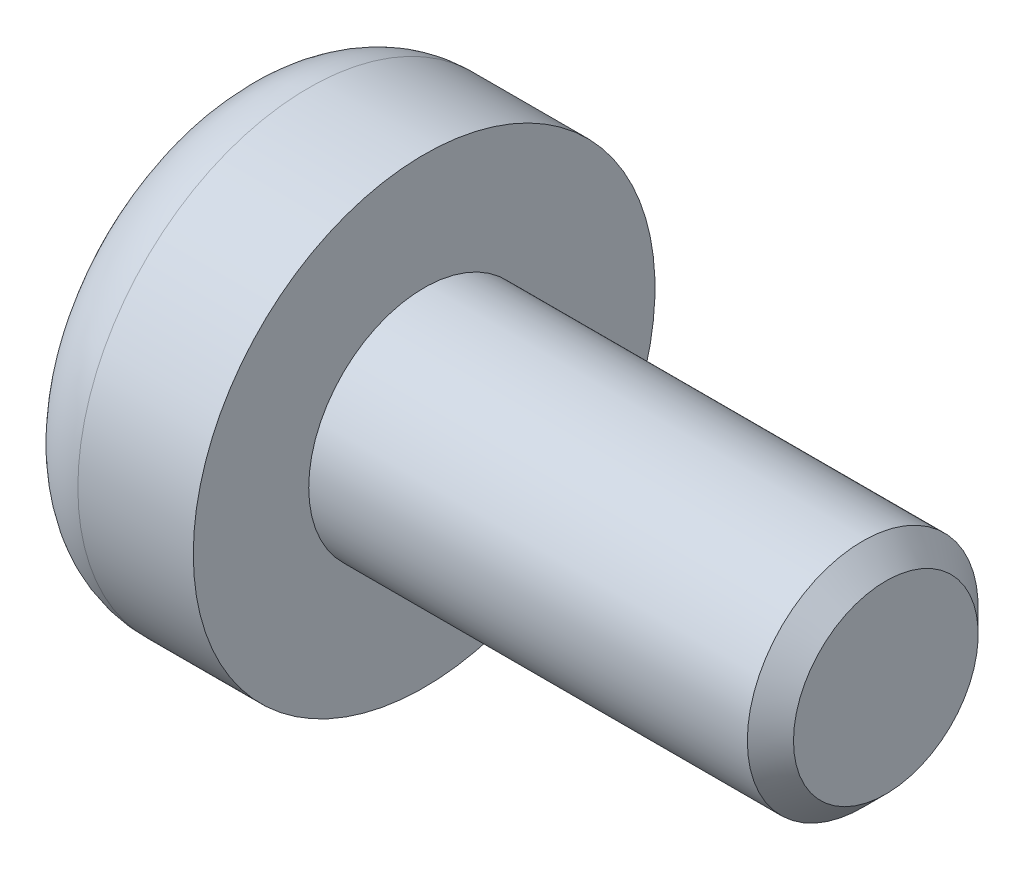
ISO-10303-21;
HEADER;
FILE_DESCRIPTION(('STEP AP214'),'2;1');
FILE_NAME('part.step','',(''),(''),'','','');
FILE_SCHEMA(('AUTOMOTIVE_DESIGN { 1 0 10303 214 1 1 1 1 }'));
ENDSEC;
DATA;
#1=APPLICATION_CONTEXT('core data for automotive mechanical design processes');
#2=APPLICATION_PROTOCOL_DEFINITION('international standard','automotive_design',2000,#1);
#3=PRODUCT_CONTEXT('',#1,'mechanical');
#4=PRODUCT('Part','Part','',(#3));
#5=PRODUCT_RELATED_PRODUCT_CATEGORY('part','',(#4));
#6=PRODUCT_DEFINITION_FORMATION('','',#4);
#7=PRODUCT_DEFINITION_CONTEXT('part definition',#1,'design');
#8=PRODUCT_DEFINITION('design','',#6,#7);
#9=PRODUCT_DEFINITION_SHAPE('','',#8);
#10=(LENGTH_UNIT() NAMED_UNIT(*) SI_UNIT(.MILLI.,.METRE.));
#11=(NAMED_UNIT(*) PLANE_ANGLE_UNIT() SI_UNIT($,.RADIAN.));
#12=(NAMED_UNIT(*) SI_UNIT($,.STERADIAN.) SOLID_ANGLE_UNIT());
#13=UNCERTAINTY_MEASURE_WITH_UNIT(LENGTH_MEASURE(1.E-05),#10,'distance_accuracy_value','');
#14=(GEOMETRIC_REPRESENTATION_CONTEXT(3) GLOBAL_UNCERTAINTY_ASSIGNED_CONTEXT((#13)) GLOBAL_UNIT_ASSIGNED_CONTEXT((#10,
#11,#12)) REPRESENTATION_CONTEXT('',''));
#15=CARTESIAN_POINT('',(0.,0.,0.));
#16=DIRECTION('',(0.,0.,1.));
#17=DIRECTION('',(1.,0.,0.));
#18=AXIS2_PLACEMENT_3D('',#15,#16,#17);
#19=CARTESIAN_POINT('',(1.,-1.,0.577350269189625));
#20=DIRECTION('',(1.,0.,0.));
#21=DIRECTION('',(0.,0.,-1.));
#22=AXIS2_PLACEMENT_3D('',#19,#20,#21);
#23=PLANE('',#22);
#24=DIRECTION('',(0.,-0.86602540378444,0.499999999999998));
#25=VECTOR('',#24,1.);
#26=CARTESIAN_POINT('',(1.,1.,0.577350269189625));
#27=LINE('',#26,#25);
#28=CARTESIAN_POINT('',(1.,0.,1.15470053837925));
#29=VERTEX_POINT('',#28);
#30=CARTESIAN_POINT('',(1.,1.,0.577350269189625));
#31=VERTEX_POINT('',#30);
#32=EDGE_CURVE('E73',#29,#31,#27,.F.);
#33=ORIENTED_EDGE('',*,*,#32,.T.);
#34=DIRECTION('',(0.,0.,1.));
#35=VECTOR('',#34,1.);
#36=CARTESIAN_POINT('',(1.,1.,-0.577350269189625));
#37=LINE('',#36,#35);
#38=CARTESIAN_POINT('',(1.,1.,-0.577350269189625));
#39=VERTEX_POINT('',#38);
#40=EDGE_CURVE('E70',#31,#39,#37,.F.);
#41=ORIENTED_EDGE('',*,*,#40,.T.);
#42=DIRECTION('',(0.,0.86602540378444,0.499999999999998));
#43=VECTOR('',#42,1.);
#44=CARTESIAN_POINT('',(1.,0.,-1.15470053837925));
#45=LINE('',#44,#43);
#46=CARTESIAN_POINT('',(1.,0.,-1.15470053837925));
#47=VERTEX_POINT('',#46);
#48=EDGE_CURVE('E67',#39,#47,#45,.F.);
#49=ORIENTED_EDGE('',*,*,#48,.T.);
#50=DIRECTION('',(0.,0.86602540378444,-0.499999999999998));
#51=VECTOR('',#50,1.);
#52=CARTESIAN_POINT('',(1.,-1.,-0.577350269189625));
#53=LINE('',#52,#51);
#54=CARTESIAN_POINT('',(1.,-1.,-0.577350269189625));
#55=VERTEX_POINT('',#54);
#56=EDGE_CURVE('E90',#47,#55,#53,.F.);
#57=ORIENTED_EDGE('',*,*,#56,.T.);
#58=DIRECTION('',(0.,0.,-1.));
#59=VECTOR('',#58,1.);
#60=CARTESIAN_POINT('',(1.,-1.,0.577350269189625));
#61=LINE('',#60,#59);
#62=CARTESIAN_POINT('',(1.,-1.,0.577350269189625));
#63=VERTEX_POINT('',#62);
#64=EDGE_CURVE('E152',#55,#63,#61,.F.);
#65=ORIENTED_EDGE('',*,*,#64,.T.);
#66=DIRECTION('',(0.,-0.86602540378444,-0.499999999999998));
#67=VECTOR('',#66,1.);
#68=CARTESIAN_POINT('',(1.,0.,1.15470053837925));
#69=LINE('',#68,#67);
#70=EDGE_CURVE('E147',#63,#29,#69,.F.);
#71=ORIENTED_EDGE('',*,*,#70,.T.);
#72=EDGE_LOOP('',(#33,#41,#49,#57,#65,#71));
#73=FACE_BOUND('',#72,.T.);
#74=ADVANCED_FACE('F16',(#73),#23,.F.);
#75=CARTESIAN_POINT('',(1.,1.,-0.577350269189625));
#76=DIRECTION('',(0.,1.,0.));
#77=DIRECTION('',(0.,0.,1.));
#78=AXIS2_PLACEMENT_3D('',#75,#76,#77);
#79=PLANE('',#78);
#80=DIRECTION('',(1.,0.,0.));
#81=VECTOR('',#80,1.);
#82=CARTESIAN_POINT('',(1.,1.,-0.577350269189625));
#83=LINE('',#82,#81);
#84=CARTESIAN_POINT('',(0.,1.,-0.577350269189625));
#85=VERTEX_POINT('',#84);
#86=EDGE_CURVE('E76',#85,#39,#83,.T.);
#87=ORIENTED_EDGE('',*,*,#86,.T.);
#88=ORIENTED_EDGE('',*,*,#40,.F.);
#89=DIRECTION('',(1.,0.,0.));
#90=VECTOR('',#89,1.);
#91=CARTESIAN_POINT('',(1.,1.,0.577350269189625));
#92=LINE('',#91,#90);
#93=CARTESIAN_POINT('',(0.,1.,0.577350269189625));
#94=VERTEX_POINT('',#93);
#95=EDGE_CURVE('E137',#31,#94,#92,.F.);
#96=ORIENTED_EDGE('',*,*,#95,.T.);
#97=DIRECTION('',(0.,0.,-1.));
#98=VECTOR('',#97,1.);
#99=CARTESIAN_POINT('',(0.,1.,0.));
#100=LINE('',#99,#98);
#101=EDGE_CURVE('E81',#94,#85,#100,.T.);
#102=ORIENTED_EDGE('',*,*,#101,.T.);
#103=EDGE_LOOP('',(#87,#88,#96,#102));
#104=FACE_BOUND('',#103,.T.);
#105=ADVANCED_FACE('F79',(#104),#79,.F.);
#106=CARTESIAN_POINT('',(1.,0.,-1.15470053837925));
#107=DIRECTION('',(0.,0.499999999999998,-0.86602540378444));
#108=DIRECTION('',(0.,0.86602540378444,0.499999999999998));
#109=AXIS2_PLACEMENT_3D('',#106,#107,#108);
#110=PLANE('',#109);
#111=DIRECTION('',(1.,0.,0.));
#112=VECTOR('',#111,1.);
#113=CARTESIAN_POINT('',(1.,0.,-1.15470053837925));
#114=LINE('',#113,#112);
#115=CARTESIAN_POINT('',(0.,0.,-1.15470053837925));
#116=VERTEX_POINT('',#115);
#117=EDGE_CURVE('E87',#116,#47,#114,.T.);
#118=ORIENTED_EDGE('',*,*,#117,.T.);
#119=ORIENTED_EDGE('',*,*,#48,.F.);
#120=ORIENTED_EDGE('',*,*,#86,.F.);
#121=DIRECTION('',(0.,-0.86602540378444,-0.499999999999998));
#122=VECTOR('',#121,1.);
#123=CARTESIAN_POINT('',(0.,1.,-0.577350269189625));
#124=LINE('',#123,#122);
#125=EDGE_CURVE('E175',#85,#116,#124,.T.);
#126=ORIENTED_EDGE('',*,*,#125,.T.);
#127=EDGE_LOOP('',(#118,#119,#120,#126));
#128=FACE_BOUND('',#127,.T.);
#129=ADVANCED_FACE('F85',(#128),#110,.F.);
#130=CARTESIAN_POINT('',(1.,-1.,-0.577350269189625));
#131=DIRECTION('',(0.,-0.499999999999998,-0.86602540378444));
#132=DIRECTION('',(0.,0.86602540378444,-0.499999999999998));
#133=AXIS2_PLACEMENT_3D('',#130,#131,#132);
#134=PLANE('',#133);
#135=DIRECTION('',(1.,0.,0.));
#136=VECTOR('',#135,1.);
#137=CARTESIAN_POINT('',(1.,-1.,-0.577350269189625));
#138=LINE('',#137,#136);
#139=CARTESIAN_POINT('',(0.,-1.,-0.577350269189625));
#140=VERTEX_POINT('',#139);
#141=EDGE_CURVE('E154',#140,#55,#138,.T.);
#142=ORIENTED_EDGE('',*,*,#141,.T.);
#143=ORIENTED_EDGE('',*,*,#56,.F.);
#144=ORIENTED_EDGE('',*,*,#117,.F.);
#145=DIRECTION('',(0.,-0.86602540378444,0.499999999999998));
#146=VECTOR('',#145,1.);
#147=CARTESIAN_POINT('',(0.,0.,-1.15470053837925));
#148=LINE('',#147,#146);
#149=EDGE_CURVE('E161',#116,#140,#148,.T.);
#150=ORIENTED_EDGE('',*,*,#149,.T.);
#151=EDGE_LOOP('',(#142,#143,#144,#150));
#152=FACE_BOUND('',#151,.T.);
#153=ADVANCED_FACE('F159',(#152),#134,.F.);
#154=CARTESIAN_POINT('',(1.,-1.,0.577350269189625));
#155=DIRECTION('',(0.,-1.,0.));
#156=DIRECTION('',(0.,0.,-1.));
#157=AXIS2_PLACEMENT_3D('',#154,#155,#156);
#158=PLANE('',#157);
#159=DIRECTION('',(1.,0.,0.));
#160=VECTOR('',#159,1.);
#161=CARTESIAN_POINT('',(1.,-1.,0.577350269189625));
#162=LINE('',#161,#160);
#163=CARTESIAN_POINT('',(0.,-1.,0.577350269189625));
#164=VERTEX_POINT('',#163);
#165=EDGE_CURVE('E149',#164,#63,#162,.T.);
#166=ORIENTED_EDGE('',*,*,#165,.T.);
#167=ORIENTED_EDGE('',*,*,#64,.F.);
#168=ORIENTED_EDGE('',*,*,#141,.F.);
#169=DIRECTION('',(0.,0.,-1.));
#170=VECTOR('',#169,1.);
#171=CARTESIAN_POINT('',(0.,-1.,0.));
#172=LINE('',#171,#170);
#173=EDGE_CURVE('E166',#140,#164,#172,.F.);
#174=ORIENTED_EDGE('',*,*,#173,.T.);
#175=EDGE_LOOP('',(#166,#167,#168,#174));
#176=FACE_BOUND('',#175,.T.);
#177=ADVANCED_FACE('F164',(#176),#158,.F.);
#178=CARTESIAN_POINT('',(1.,0.,1.15470053837925));
#179=DIRECTION('',(0.,-0.499999999999998,0.86602540378444));
#180=DIRECTION('',(0.,-0.86602540378444,-0.499999999999998));
#181=AXIS2_PLACEMENT_3D('',#178,#179,#180);
#182=PLANE('',#181);
#183=DIRECTION('',(1.,0.,0.));
#184=VECTOR('',#183,1.);
#185=CARTESIAN_POINT('',(1.,0.,1.15470053837925));
#186=LINE('',#185,#184);
#187=CARTESIAN_POINT('',(0.,0.,1.15470053837925));
#188=VERTEX_POINT('',#187);
#189=EDGE_CURVE('E145',#188,#29,#186,.T.);
#190=ORIENTED_EDGE('',*,*,#189,.T.);
#191=ORIENTED_EDGE('',*,*,#70,.F.);
#192=ORIENTED_EDGE('',*,*,#165,.F.);
#193=DIRECTION('',(0.,0.86602540378444,0.499999999999998));
#194=VECTOR('',#193,1.);
#195=CARTESIAN_POINT('',(0.,-1.,0.577350269189625));
#196=LINE('',#195,#194);
#197=EDGE_CURVE('E34',#164,#188,#196,.T.);
#198=ORIENTED_EDGE('',*,*,#197,.T.);
#199=EDGE_LOOP('',(#190,#191,#192,#198));
#200=FACE_BOUND('',#199,.T.);
#201=ADVANCED_FACE('F167',(#200),#182,.F.);
#202=CARTESIAN_POINT('',(1.,1.,0.577350269189625));
#203=DIRECTION('',(0.,0.499999999999998,0.86602540378444));
#204=DIRECTION('',(0.,-0.86602540378444,0.499999999999998));
#205=AXIS2_PLACEMENT_3D('',#202,#203,#204);
#206=PLANE('',#205);
#207=ORIENTED_EDGE('',*,*,#95,.F.);
#208=ORIENTED_EDGE('',*,*,#32,.F.);
#209=ORIENTED_EDGE('',*,*,#189,.F.);
#210=DIRECTION('',(0.,0.86602540378444,-0.499999999999998));
#211=VECTOR('',#210,1.);
#212=CARTESIAN_POINT('',(0.,0.,1.15470053837925));
#213=LINE('',#212,#211);
#214=EDGE_CURVE('E109',#188,#94,#213,.T.);
#215=ORIENTED_EDGE('',*,*,#214,.T.);
#216=EDGE_LOOP('',(#207,#208,#209,#215));
#217=FACE_BOUND('',#216,.T.);
#218=ADVANCED_FACE('F171',(#217),#206,.F.);
#219=CARTESIAN_POINT('',(0.,0.,0.));
#220=DIRECTION('',(1.,0.,0.));
#221=DIRECTION('',(0.,0.,-1.));
#222=AXIS2_PLACEMENT_3D('',#219,#220,#221);
#223=PLANE('',#222);
#224=ORIENTED_EDGE('',*,*,#197,.F.);
#225=ORIENTED_EDGE('',*,*,#173,.F.);
#226=ORIENTED_EDGE('',*,*,#149,.F.);
#227=ORIENTED_EDGE('',*,*,#125,.F.);
#228=ORIENTED_EDGE('',*,*,#101,.F.);
#229=ORIENTED_EDGE('',*,*,#214,.F.);
#230=EDGE_LOOP('',(#224,#225,#226,#227,#228,#229));
#231=FACE_BOUND('',#230,.T.);
#232=CARTESIAN_POINT('',(0.,0.,0.));
#233=DIRECTION('',(1.,0.,0.));
#234=DIRECTION('',(0.,0.,-1.));
#235=AXIS2_PLACEMENT_3D('',#232,#233,#234);
#236=CIRCLE('',#235,2.);
#237=CARTESIAN_POINT('',(0.,0.,-2.));
#238=VERTEX_POINT('',#237);
#239=EDGE_CURVE('E104',#238,#238,#236,.T.);
#240=ORIENTED_EDGE('',*,*,#239,.F.);
#241=EDGE_LOOP('',(#240));
#242=FACE_BOUND('',#241,.T.);
#243=ADVANCED_FACE('F126',(#231,#242),#223,.F.);
#244=CARTESIAN_POINT('',(1.,0.,0.));
#245=DIRECTION('',(1.,0.,0.));
#246=DIRECTION('',(0.,0.,-1.));
#247=AXIS2_PLACEMENT_3D('',#244,#245,#246);
#248=TOROIDAL_SURFACE('',#247,2.,1.);
#249=CARTESIAN_POINT('',(1.,0.,0.));
#250=DIRECTION('',(-1.,0.,0.));
#251=DIRECTION('',(0.,0.,1.));
#252=AXIS2_PLACEMENT_3D('',#249,#250,#251);
#253=CIRCLE('',#252,3.);
#254=CARTESIAN_POINT('',(1.,0.,3.));
#255=VERTEX_POINT('',#254);
#256=EDGE_CURVE('E100',#255,#255,#253,.F.);
#257=ORIENTED_EDGE('',*,*,#256,.F.);
#258=EDGE_LOOP('',(#257));
#259=FACE_BOUND('',#258,.T.);
#260=ORIENTED_EDGE('',*,*,#239,.T.);
#261=EDGE_LOOP('',(#260));
#262=FACE_BOUND('',#261,.T.);
#263=ADVANCED_FACE('F120',(#259,#262),#248,.T.);
#264=CARTESIAN_POINT('',(-2.72225619418102,0.,0.));
#265=DIRECTION('',(-1.,0.,0.));
#266=DIRECTION('',(0.,0.,1.));
#267=AXIS2_PLACEMENT_3D('',#264,#265,#266);
#268=CYLINDRICAL_SURFACE('',#267,3.);
#269=ORIENTED_EDGE('',*,*,#256,.T.);
#270=EDGE_LOOP('',(#269));
#271=FACE_BOUND('',#270,.T.);
#272=CARTESIAN_POINT('',(2.5,0.,0.));
#273=DIRECTION('',(-1.,0.,0.));
#274=DIRECTION('',(0.,0.,1.));
#275=AXIS2_PLACEMENT_3D('',#272,#273,#274);
#276=CIRCLE('',#275,3.);
#277=CARTESIAN_POINT('',(2.5,0.,3.));
#278=VERTEX_POINT('',#277);
#279=EDGE_CURVE('E19',#278,#278,#276,.T.);
#280=ORIENTED_EDGE('',*,*,#279,.T.);
#281=EDGE_LOOP('',(#280));
#282=FACE_BOUND('',#281,.T.);
#283=ADVANCED_FACE('F125',(#271,#282),#268,.T.);
#284=CARTESIAN_POINT('',(8.5,1.5,0.));
#285=DIRECTION('',(-1.,0.,0.));
#286=DIRECTION('',(0.,0.,1.));
#287=AXIS2_PLACEMENT_3D('',#284,#285,#286);
#288=PLANE('',#287);
#289=CARTESIAN_POINT('',(8.50000000031059,0.,0.));
#290=DIRECTION('',(-1.,0.,0.));
#291=DIRECTION('',(0.,0.,1.));
#292=AXIS2_PLACEMENT_3D('',#289,#290,#291);
#293=CIRCLE('',#292,1.20000000026721);
#294=CARTESIAN_POINT('',(8.50000000031059,0.,1.20000000026721));
#295=VERTEX_POINT('',#294);
#296=EDGE_CURVE('E95',#295,#295,#293,.T.);
#297=ORIENTED_EDGE('',*,*,#296,.F.);
#298=EDGE_LOOP('',(#297));
#299=FACE_BOUND('',#298,.T.);
#300=ADVANCED_FACE('F206',(#299),#288,.F.);
#301=CARTESIAN_POINT('',(2.5,3.,0.));
#302=DIRECTION('',(-1.,0.,0.));
#303=DIRECTION('',(0.,0.,1.));
#304=AXIS2_PLACEMENT_3D('',#301,#302,#303);
#305=PLANE('',#304);
#306=CARTESIAN_POINT('',(2.5,0.,0.));
#307=DIRECTION('',(-1.,0.,0.));
#308=DIRECTION('',(0.,0.,1.));
#309=AXIS2_PLACEMENT_3D('',#306,#307,#308);
#310=CIRCLE('',#309,1.5);
#311=CARTESIAN_POINT('',(2.5,0.,1.5));
#312=VERTEX_POINT('',#311);
#313=EDGE_CURVE('E25',#312,#312,#310,.F.);
#314=ORIENTED_EDGE('',*,*,#313,.F.);
#315=EDGE_LOOP('',(#314));
#316=FACE_BOUND('',#315,.T.);
#317=ORIENTED_EDGE('',*,*,#279,.F.);
#318=EDGE_LOOP('',(#317));
#319=FACE_BOUND('',#318,.T.);
#320=ADVANCED_FACE('F201',(#316,#319),#305,.F.);
#321=CARTESIAN_POINT('',(8.19999999998799,0.,0.));
#322=DIRECTION('',(-1.,0.,0.));
#323=DIRECTION('',(0.,0.,1.));
#324=AXIS2_PLACEMENT_3D('',#321,#322,#323);
#325=CONICAL_SURFACE('',#324,1.50000000002137,0.785398162450058);
#326=ORIENTED_EDGE('',*,*,#296,.T.);
#327=EDGE_LOOP('',(#326));
#328=FACE_BOUND('',#327,.T.);
#329=CARTESIAN_POINT('',(8.2,0.,0.));
#330=DIRECTION('',(-1.,0.,0.));
#331=DIRECTION('',(0.,0.,1.));
#332=AXIS2_PLACEMENT_3D('',#329,#330,#331);
#333=CIRCLE('',#332,1.5);
#334=CARTESIAN_POINT('',(8.2,0.,1.5));
#335=VERTEX_POINT('',#334);
#336=EDGE_CURVE('E11',#335,#335,#333,.T.);
#337=ORIENTED_EDGE('',*,*,#336,.F.);
#338=EDGE_LOOP('',(#337));
#339=FACE_BOUND('',#338,.T.);
#340=ADVANCED_FACE('F195',(#328,#339),#325,.T.);
#341=CARTESIAN_POINT('',(-2.72225619418102,0.,0.));
#342=DIRECTION('',(-1.,0.,0.));
#343=DIRECTION('',(0.,0.,1.));
#344=AXIS2_PLACEMENT_3D('',#341,#342,#343);
#345=CYLINDRICAL_SURFACE('',#344,1.5);
#346=ORIENTED_EDGE('',*,*,#336,.T.);
#347=EDGE_LOOP('',(#346));
#348=FACE_BOUND('',#347,.T.);
#349=ORIENTED_EDGE('',*,*,#313,.T.);
#350=EDGE_LOOP('',(#349));
#351=FACE_BOUND('',#350,.T.);
#352=ADVANCED_FACE('F193',(#348,#351),#345,.T.);
#353=CLOSED_SHELL('',(#74,#105,#129,#153,#177,#201,#218,#243,#263,#283,#300,#320,#340,#352));
#354=MANIFOLD_SOLID_BREP('B1',#353);
#355=ADVANCED_BREP_SHAPE_REPRESENTATION('',(#18,#354),#14);
#356=SHAPE_DEFINITION_REPRESENTATION(#9,#355);
ENDSEC;
END-ISO-10303-21;
